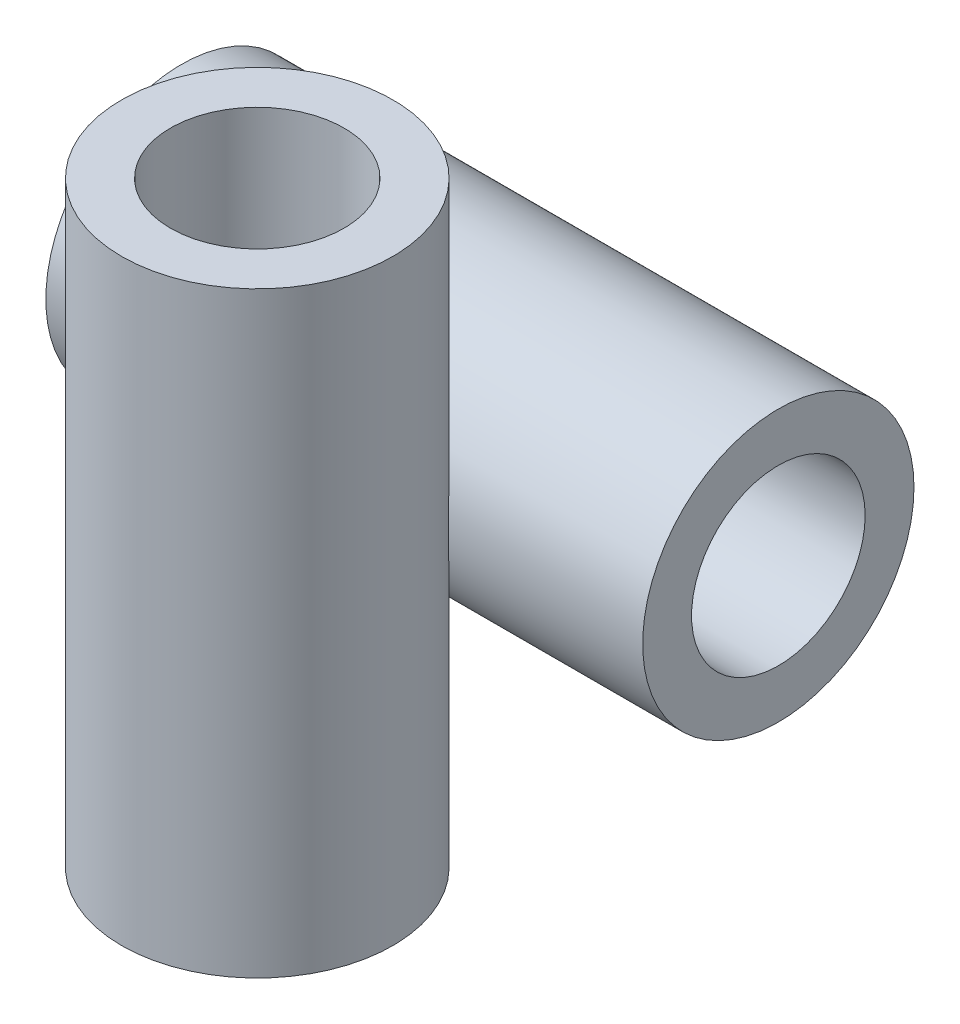
ISO-10303-21;
HEADER;
FILE_DESCRIPTION(('STEP AP214'),'2;1');
FILE_NAME('part.step','',(''),(''),'','','');
FILE_SCHEMA(('AUTOMOTIVE_DESIGN { 1 0 10303 214 1 1 1 1 }'));
ENDSEC;
DATA;
#1=APPLICATION_CONTEXT('core data for automotive mechanical design processes');
#2=APPLICATION_PROTOCOL_DEFINITION('international standard','automotive_design',2000,#1);
#3=PRODUCT_CONTEXT('',#1,'mechanical');
#4=PRODUCT('Part','Part','',(#3));
#5=PRODUCT_RELATED_PRODUCT_CATEGORY('part','',(#4));
#6=PRODUCT_DEFINITION_FORMATION('','',#4);
#7=PRODUCT_DEFINITION_CONTEXT('part definition',#1,'design');
#8=PRODUCT_DEFINITION('design','',#6,#7);
#9=PRODUCT_DEFINITION_SHAPE('','',#8);
#10=(LENGTH_UNIT() NAMED_UNIT(*) SI_UNIT(.MILLI.,.METRE.));
#11=(NAMED_UNIT(*) PLANE_ANGLE_UNIT() SI_UNIT($,.RADIAN.));
#12=(NAMED_UNIT(*) SI_UNIT($,.STERADIAN.) SOLID_ANGLE_UNIT());
#13=UNCERTAINTY_MEASURE_WITH_UNIT(LENGTH_MEASURE(1.E-05),#10,'distance_accuracy_value','');
#14=(GEOMETRIC_REPRESENTATION_CONTEXT(3) GLOBAL_UNCERTAINTY_ASSIGNED_CONTEXT((#13)) GLOBAL_UNIT_ASSIGNED_CONTEXT((#10,
#11,#12)) REPRESENTATION_CONTEXT('',''));
#15=CARTESIAN_POINT('',(0.,0.,0.));
#16=DIRECTION('',(0.,0.,1.));
#17=DIRECTION('',(1.,0.,0.));
#18=AXIS2_PLACEMENT_3D('',#15,#16,#17);
#19=CARTESIAN_POINT('',(0.,110.,0.));
#20=DIRECTION('',(0.,1.,0.));
#21=DIRECTION('',(0.,0.,1.));
#22=AXIS2_PLACEMENT_3D('',#19,#20,#21);
#23=PLANE('',#22);
#24=CARTESIAN_POINT('',(0.,110.,0.));
#25=DIRECTION('',(0.,1.,0.));
#26=DIRECTION('',(0.,0.,1.));
#27=AXIS2_PLACEMENT_3D('',#24,#25,#26);
#28=CIRCLE('',#27,25.);
#29=CARTESIAN_POINT('',(0.,110.,25.));
#30=VERTEX_POINT('',#29);
#31=EDGE_CURVE('E10',#30,#30,#28,.T.);
#32=ORIENTED_EDGE('',*,*,#31,.T.);
#33=EDGE_LOOP('',(#32));
#34=FACE_BOUND('',#33,.T.);
#35=CARTESIAN_POINT('',(0.,110.,0.));
#36=DIRECTION('',(0.,1.,0.));
#37=DIRECTION('',(0.,0.,1.));
#38=AXIS2_PLACEMENT_3D('',#35,#36,#37);
#39=CIRCLE('',#38,16.);
#40=CARTESIAN_POINT('',(0.,110.,16.));
#41=VERTEX_POINT('',#40);
#42=EDGE_CURVE('E55',#41,#41,#39,.T.);
#43=ORIENTED_EDGE('',*,*,#42,.F.);
#44=EDGE_LOOP('',(#43));
#45=FACE_BOUND('',#44,.T.);
#46=ADVANCED_FACE('F37',(#34,#45),#23,.T.);
#47=CARTESIAN_POINT('',(0.,0.,0.));
#48=DIRECTION('',(0.,1.,0.));
#49=DIRECTION('',(0.,0.,1.));
#50=AXIS2_PLACEMENT_3D('',#47,#48,#49);
#51=PLANE('',#50);
#52=CARTESIAN_POINT('',(0.,0.,0.));
#53=DIRECTION('',(0.,1.,0.));
#54=DIRECTION('',(0.,0.,1.));
#55=AXIS2_PLACEMENT_3D('',#52,#53,#54);
#56=CIRCLE('',#55,25.);
#57=CARTESIAN_POINT('',(0.,0.,25.));
#58=VERTEX_POINT('',#57);
#59=EDGE_CURVE('E50',#58,#58,#56,.T.);
#60=ORIENTED_EDGE('',*,*,#59,.F.);
#61=EDGE_LOOP('',(#60));
#62=FACE_BOUND('',#61,.T.);
#63=CARTESIAN_POINT('',(0.,0.,0.));
#64=DIRECTION('',(0.,1.,0.));
#65=DIRECTION('',(0.,0.,1.));
#66=AXIS2_PLACEMENT_3D('',#63,#64,#65);
#67=CIRCLE('',#66,16.);
#68=CARTESIAN_POINT('',(0.,0.,16.));
#69=VERTEX_POINT('',#68);
#70=EDGE_CURVE('E57',#69,#69,#67,.T.);
#71=ORIENTED_EDGE('',*,*,#70,.T.);
#72=EDGE_LOOP('',(#71));
#73=FACE_BOUND('',#72,.T.);
#74=ADVANCED_FACE('F100',(#62,#73),#51,.F.);
#75=CARTESIAN_POINT('',(0.,110.,0.));
#76=DIRECTION('',(0.,-1.,0.));
#77=DIRECTION('',(0.,0.,-1.));
#78=AXIS2_PLACEMENT_3D('',#75,#76,#77);
#79=CYLINDRICAL_SURFACE('',#78,25.);
#80=CARTESIAN_POINT('',(0.,74.3282862126411,-25.));
#81=CARTESIAN_POINT('',(-0.517953633721764,74.3282873528692,-24.9999975044833));
#82=CARTESIAN_POINT('',(-1.0359587833521,74.3148507108705,-24.9838813194227));
#83=CARTESIAN_POINT('',(-2.06875068696084,74.2608799539766,-24.9196333783539));
#84=CARTESIAN_POINT('',(-2.58353604379598,74.2203348018526,-24.8714885819377));
#85=CARTESIAN_POINT('',(-3.60717211940676,74.1114056479138,-24.7437825866778));
#86=CARTESIAN_POINT('',(-4.11601073608163,74.0429725518489,-24.6641659919821));
#87=CARTESIAN_POINT('',(-5.12323102727105,73.8772698830369,-24.4747840542282));
#88=CARTESIAN_POINT('',(-5.6216138234165,73.7800034204537,-24.3650219629631));
#89=CARTESIAN_POINT('',(-6.60514596088624,73.5551685844986,-24.1169988872739));
#90=CARTESIAN_POINT('',(-7.09027338347401,73.427553051749,-23.9786935942712));
#91=CARTESIAN_POINT('',(-8.04281266569251,73.1406509004897,-23.6762086365341));
#92=CARTESIAN_POINT('',(-8.51022408757037,72.9813634999917,-23.5120283329583));
#93=CARTESIAN_POINT('',(-9.42325503437416,72.6298393360986,-23.1612008972291));
#94=CARTESIAN_POINT('',(-9.86889267029019,72.4376305770212,-22.9745728998937));
#95=CARTESIAN_POINT('',(-10.7352322933322,72.0189712097561,-22.5827540024518));
#96=CARTESIAN_POINT('',(-11.1559354321027,71.7925221847349,-22.3775639607744));
#97=CARTESIAN_POINT('',(-11.9575907378433,71.3115492804688,-21.9593853583685));
#98=CARTESIAN_POINT('',(-12.3393324261994,71.0580051552465,-21.7467836707533));
#99=CARTESIAN_POINT('',(-13.0736108004531,70.5177425844619,-21.3134336599617));
#100=CARTESIAN_POINT('',(-13.4261480125292,70.2310247368155,-21.0926854836646));
#101=CARTESIAN_POINT('',(-14.0999462354905,69.6250201195386,-20.6483511042888));
#102=CARTESIAN_POINT('',(-14.4212119998021,69.3057383149597,-20.4247653383976));
#103=CARTESIAN_POINT('',(-15.0311894996748,68.6358609974691,-19.9801359230844));
#104=CARTESIAN_POINT('',(-15.3199021792396,68.285266393123,-19.7590922001129));
#105=CARTESIAN_POINT('',(-15.8503609773594,67.5732949420723,-19.3358563145572));
#106=CARTESIAN_POINT('',(-16.0937466419236,67.2133671982754,-19.1332766642712));
#107=CARTESIAN_POINT('',(-16.5507112062009,66.469269288606,-18.7393964895579));
#108=CARTESIAN_POINT('',(-16.7642911934181,66.0851000079649,-18.5480955537571));
#109=CARTESIAN_POINT('',(-17.1622217909257,65.2949604113229,-18.180527027844));
#110=CARTESIAN_POINT('',(-17.3465668633523,64.8889859843032,-18.004262288899));
#111=CARTESIAN_POINT('',(-17.6868667536758,64.0580373899516,-17.6700776351442));
#112=CARTESIAN_POINT('',(-17.8428205571564,63.6330625444129,-17.5121583758889));
#113=CARTESIAN_POINT('',(-18.1312124813944,62.7554185143635,-17.2134658601824));
#114=CARTESIAN_POINT('',(-18.2629122063517,62.3023129537141,-17.0732624582864));
#115=CARTESIAN_POINT('',(-18.4987564190375,61.3822199560502,-16.8174400998506));
#116=CARTESIAN_POINT('',(-18.6029005844273,60.9152323567178,-16.7018214309006));
#117=CARTESIAN_POINT('',(-18.7848230236158,59.9703380572837,-16.4969454651314));
#118=CARTESIAN_POINT('',(-18.8625941446095,59.4924284324017,-16.4076953207352));
#119=CARTESIAN_POINT('',(-18.992713513834,58.5288395794921,-16.2568983868913));
#120=CARTESIAN_POINT('',(-19.0450607720634,58.043160049666,-16.195352676257));
#121=CARTESIAN_POINT('',(-19.1276543603636,57.0351664864274,-16.0977401088489));
#122=CARTESIAN_POINT('',(-19.1562371881154,56.5125285186579,-16.0635960967964));
#123=CARTESIAN_POINT('',(-19.1858303252451,55.4653511081407,-16.0282386715825));
#124=CARTESIAN_POINT('',(-19.1868394689839,54.9408115859449,-16.0270266505753));
#125=CARTESIAN_POINT('',(-19.1612958819862,53.8932156868591,-16.0575571102573));
#126=CARTESIAN_POINT('',(-19.1347356171913,53.3701597545771,-16.0893085990837));
#127=CARTESIAN_POINT('',(-19.0536090384722,52.329219992043,-16.185299569881));
#128=CARTESIAN_POINT('',(-18.9990425740923,51.811336189592,-16.2495392263855));
#129=CARTESIAN_POINT('',(-18.8592143205492,50.7706375763244,-16.4116364039449));
#130=CARTESIAN_POINT('',(-18.7731733060007,50.2480591255066,-16.5103441615603));
#131=CARTESIAN_POINT('',(-18.5693801649537,49.2161106293367,-16.7392227570062));
#132=CARTESIAN_POINT('',(-18.4516272442795,48.7067409151272,-16.8693943827923));
#133=CARTESIAN_POINT('',(-18.1829067435898,47.7054482549207,-17.158695770974));
#134=CARTESIAN_POINT('',(-18.0319502428985,47.2135195526608,-17.3178158708285));
#135=CARTESIAN_POINT('',(-17.6951852481737,46.2510409314318,-17.6617751736294));
#136=CARTESIAN_POINT('',(-17.5093786686043,45.780489839862,-17.8466129636488));
#137=CARTESIAN_POINT('',(-17.109185952697,44.8821188787339,-18.2304587461717));
#138=CARTESIAN_POINT('',(-16.8961489260112,44.4533555576828,-18.4286648126151));
#139=CARTESIAN_POINT('',(-16.4355219393306,43.6226790728621,-18.8406217026762));
#140=CARTESIAN_POINT('',(-16.1879329060349,43.2207651894069,-19.0543721093148));
#141=CARTESIAN_POINT('',(-15.6579562166463,42.4469604522606,-19.4922145888716));
#142=CARTESIAN_POINT('',(-15.3755864451691,42.0750543297577,-19.7163013099746));
#143=CARTESIAN_POINT('',(-14.7762914546793,41.3634505091307,-20.1693384514433));
#144=CARTESIAN_POINT('',(-14.4593680007335,41.0237511674796,-20.3982886228943));
#145=CARTESIAN_POINT('',(-13.8135538485315,40.3989675704294,-20.8405591359707));
#146=CARTESIAN_POINT('',(-13.486737644505,40.1117771547534,-21.0539392748365));
#147=CARTESIAN_POINT('',(-12.8054225504333,39.567798393764,-21.4751368060656));
#148=CARTESIAN_POINT('',(-12.4509249256213,39.3110086602765,-21.6829544520912));
#149=CARTESIAN_POINT('',(-11.7162788758663,38.8279289324475,-22.0885689440324));
#150=CARTESIAN_POINT('',(-11.3361270763312,38.6016429624023,-22.2863644656064));
#151=CARTESIAN_POINT('',(-10.5527014718426,38.1792063282116,-22.6678253812894));
#152=CARTESIAN_POINT('',(-10.1494271467532,37.983056342334,-22.8514904573194));
#153=CARTESIAN_POINT('',(-9.3231544855695,37.6203622250153,-23.2008554655049));
#154=CARTESIAN_POINT('',(-8.90018640094788,37.4537744615558,-23.3665817308227));
#155=CARTESIAN_POINT('',(-8.03688618449848,37.1487858540668,-23.6773931462552));
#156=CARTESIAN_POINT('',(-7.59655417090433,37.010384818149,-23.8224784368864));
#157=CARTESIAN_POINT('',(-6.70137677749992,36.7605671684782,-24.0896199372428));
#158=CARTESIAN_POINT('',(-6.24652789462596,36.6491571244952,-24.2116705385914));
#159=CARTESIAN_POINT('',(-5.32535994069889,36.4522186245966,-24.4308151290843));
#160=CARTESIAN_POINT('',(-4.85904037493124,36.3666912870896,-24.5279080397632));
#161=CARTESIAN_POINT('',(-3.88848947428199,36.2159593621827,-24.7009615928077));
#162=CARTESIAN_POINT('',(-3.38370675714088,36.1523537577379,-24.7752278631062));
#163=CARTESIAN_POINT('',(-2.36788706688761,36.0522965352221,-24.8928621795608));
#164=CARTESIAN_POINT('',(-1.85684986083351,36.0158459316583,-24.9362290713177));
#165=CARTESIAN_POINT('',(-0.831715086756126,35.96953151271,-24.9914347890302));
#166=CARTESIAN_POINT('',(-0.317616607316615,35.9596760574163,-25.0032637011194));
#167=CARTESIAN_POINT('',(0.710162093404742,35.9664200588575,-24.995195355557));
#168=CARTESIAN_POINT('',(1.22384230617212,35.9830200412983,-24.9752974674504));
#169=CARTESIAN_POINT('',(2.27057188325956,36.0442901989976,-24.9024490846939));
#170=CARTESIAN_POINT('',(2.80344940320723,36.0901931294379,-24.8480477383005));
#171=CARTESIAN_POINT('',(3.86128244842455,36.2119469635966,-24.7057750137966));
#172=CARTESIAN_POINT('',(4.38623768814633,36.2877989441241,-24.617902432242));
#173=CARTESIAN_POINT('',(5.42425320223713,36.4706207252682,-24.4101942929505));
#174=CARTESIAN_POINT('',(5.93731430510363,36.5775883514205,-24.2903609687848));
#175=CARTESIAN_POINT('',(6.94755218266854,36.8241149622915,-24.020923588708));
#176=CARTESIAN_POINT('',(7.4447294944952,36.9636728436051,-23.871320540733));
#177=CARTESIAN_POINT('',(8.41097718014846,37.2743626145838,-23.5480493417089));
#178=CARTESIAN_POINT('',(8.88037893977275,37.4449262192408,-23.3748264672394));
#179=CARTESIAN_POINT('',(9.79607606582866,37.8205781002481,-23.0060966415598));
#180=CARTESIAN_POINT('',(10.2423716475406,38.0256660548593,-22.8105898980229));
#181=CARTESIAN_POINT('',(11.1079181464921,38.4713862135064,-22.4018544705741));
#182=CARTESIAN_POINT('',(11.5271856418407,38.711996325632,-22.1886368371937));
#183=CARTESIAN_POINT('',(12.335644448553,39.2294735944165,-21.7495622621362));
#184=CARTESIAN_POINT('',(12.7248377996581,39.5063382887155,-21.5237061794409));
#185=CARTESIAN_POINT('',(13.4462263418309,40.0770785274814,-21.0800048390239));
#186=CARTESIAN_POINT('',(13.7804808466549,40.3686886264402,-20.8625890903034));
#187=CARTESIAN_POINT('',(14.4186191079555,40.9827481817933,-20.426765006898));
#188=CARTESIAN_POINT('',(14.7225042522597,41.3051962276273,-20.2083567180478));
#189=CARTESIAN_POINT('',(15.2988728053646,41.9794966025844,-19.7756015597316));
#190=CARTESIAN_POINT('',(15.5713574683479,42.331347756334,-19.5612545283388));
#191=CARTESIAN_POINT('',(16.0845849378449,43.0624408407974,-19.1414754840572));
#192=CARTESIAN_POINT('',(16.3253276991401,43.44168281053,-18.9360434838688));
#193=CARTESIAN_POINT('',(16.7686407365233,44.2134064878821,-18.5444758504696));
#194=CARTESIAN_POINT('',(16.9721312780594,44.6051620971073,-18.3579486519958));
#195=CARTESIAN_POINT('',(17.3501262871487,45.4094670545126,-18.001130484302));
#196=CARTESIAN_POINT('',(17.5246314741303,45.8220158862649,-17.8308391121469));
#197=CARTESIAN_POINT('',(17.8456614358648,46.6652202719794,-17.5095397692082));
#198=CARTESIAN_POINT('',(17.992179689506,47.0958800174328,-17.3585362953216));
#199=CARTESIAN_POINT('',(18.2583079124454,47.9723561538072,-17.0783937163301));
#200=CARTESIAN_POINT('',(18.3779167318708,48.4181731914811,-16.9492555456147));
#201=CARTESIAN_POINT('',(18.5965953539385,49.3442728617745,-16.7091092425585));
#202=CARTESIAN_POINT('',(18.6943690649822,49.8251731848173,-16.5993019276714));
#203=CARTESIAN_POINT('',(18.8627345110882,50.7972007156519,-16.4077271870539));
#204=CARTESIAN_POINT('',(18.933325515515,51.2883281979623,-16.3259605150259));
#205=CARTESIAN_POINT('',(19.0482990336191,52.2777444443053,-16.1916684982395));
#206=CARTESIAN_POINT('',(19.0926736706394,52.7760353145497,-16.1391519418931));
#207=CARTESIAN_POINT('',(19.1558264682133,53.7764865240159,-16.0641434970459));
#208=CARTESIAN_POINT('',(19.1746038337553,54.2786469829341,-16.0416525410943));
#209=CARTESIAN_POINT('',(19.1872041788129,55.3132747149543,-16.0265823858399));
#210=CARTESIAN_POINT('',(19.1794959317984,55.8457889104823,-16.0358385448125));
#211=CARTESIAN_POINT('',(19.1355719620163,56.907986478408,-16.0882267690925));
#212=CARTESIAN_POINT('',(19.0993550500107,57.4376697317851,-16.1313602475911));
#213=CARTESIAN_POINT('',(18.9978032984884,58.4905506035063,-16.2508343316717));
#214=CARTESIAN_POINT('',(18.9324642415243,59.0137472711843,-16.3271797469432));
#215=CARTESIAN_POINT('',(18.7716456153338,60.0497757535449,-16.5118229770124));
#216=CARTESIAN_POINT('',(18.6761664279343,60.5626076994445,-16.6201203870286));
#217=CARTESIAN_POINT('',(18.4531067695903,61.5768033465673,-16.8674455516515));
#218=CARTESIAN_POINT('',(18.3253538207701,62.078089114665,-17.0066379141821));
#219=CARTESIAN_POINT('',(18.0364394317021,63.0622653225011,-17.3127442404446));
#220=CARTESIAN_POINT('',(17.8752776789587,63.5451555901237,-17.4796584634754));
#221=CARTESIAN_POINT('',(17.5180723573554,64.488269060634,-17.8376287096808));
#222=CARTESIAN_POINT('',(17.3220473330991,64.9485041489882,-18.0286718825101));
#223=CARTESIAN_POINT('',(16.8937283460529,65.8426698746865,-18.4306300134555));
#224=CARTESIAN_POINT('',(16.6614368775599,66.2766023182001,-18.6415436045487));
#225=CARTESIAN_POINT('',(16.173538665676,67.091546267832,-19.0660779356107));
#226=CARTESIAN_POINT('',(15.9199152685591,67.4741556014302,-19.2789126569829));
#227=CARTESIAN_POINT('',(15.3793917918431,68.2100937146553,-19.7127964306165));
#228=CARTESIAN_POINT('',(15.0924930112956,68.5634236364109,-19.9338451619791));
#229=CARTESIAN_POINT('',(14.4860867282448,69.2386454489926,-20.3787784272938));
#230=CARTESIAN_POINT('',(14.1665915355199,69.5605491184845,-20.6026618629707));
#231=CARTESIAN_POINT('',(13.4961931463102,70.1717225129374,-21.047912486967));
#232=CARTESIAN_POINT('',(13.1452907907968,70.4609931112266,-21.269279742482));
#233=CARTESIAN_POINT('',(12.4331562657018,70.9920641063499,-21.6928377161064));
#234=CARTESIAN_POINT('',(12.0734174114919,71.2355534755847,-21.895426430788));
#235=CARTESIAN_POINT('',(11.3296924190018,71.6927355392826,-22.2893497966137));
#236=CARTESIAN_POINT('',(10.9457070663019,71.9064291984003,-22.4806848119874));
#237=CARTESIAN_POINT('',(10.1557470133778,72.3046853215707,-22.8484298474253));
#238=CARTESIAN_POINT('',(9.74975817878667,72.4892287552372,-23.0248300829148));
#239=CARTESIAN_POINT('',(8.91876591619526,72.8299000189021,-23.3592858202235));
#240=CARTESIAN_POINT('',(8.49376226225129,72.9860275111361,-23.5173411039785));
#241=CARTESIAN_POINT('',(7.61580418029329,73.2748284269027,-23.8163891924363));
#242=CARTESIAN_POINT('',(7.16240383209262,73.4067477686921,-23.9568004627071));
#243=CARTESIAN_POINT('',(6.24163957454573,73.6429951991611,-24.2130201759535));
#244=CARTESIAN_POINT('',(5.77427410715302,73.747320196334,-24.3288258619798));
#245=CARTESIAN_POINT('',(4.82939443484276,73.9294009054188,-24.5338614754249));
#246=CARTESIAN_POINT('',(4.35189537388473,74.0071936550095,-24.6231284270392));
#247=CARTESIAN_POINT('',(3.38929188999828,74.1373706078771,-24.7739769516298));
#248=CARTESIAN_POINT('',(2.90419020891768,74.1897637631892,-24.8355682782635));
#249=CARTESIAN_POINT('',(2.01607743003004,74.2627511854035,-24.9218285805716));
#250=CARTESIAN_POINT('',(1.61383184410894,74.2873467423379,-24.9511195442129));
#251=CARTESIAN_POINT('',(0.807734609049487,74.3201137788239,-24.9902061882189));
#252=CARTESIAN_POINT('',(0.403882966288693,74.3282853235293,-25.0000019459207));
#253=CARTESIAN_POINT('',(0.,74.3282862126411,-25.));
#254=B_SPLINE_CURVE_WITH_KNOTS('',3,(#80,#81,#82,#83,#84,#85,#86,#87,#88,#89,#90,#91,#92,#93,
#94,#95,#96,#97,#98,#99,#100,#101,#102,#103,#104,#105,#106,#107,#108,#109,#110,#111,#112,#113,
#114,#115,#116,#117,#118,#119,#120,#121,#122,#123,#124,#125,#126,#127,#128,#129,#130,#131,#132,
#133,#134,#135,#136,#137,#138,#139,#140,#141,#142,#143,#144,#145,#146,#147,#148,#149,#150,#151,
#152,#153,#154,#155,#156,#157,#158,#159,#160,#161,#162,#163,#164,#165,#166,#167,#168,#169,#170,
#171,#172,#173,#174,#175,#176,#177,#178,#179,#180,#181,#182,#183,#184,#185,#186,#187,#188,#189,
#190,#191,#192,#193,#194,#195,#196,#197,#198,#199,#200,#201,#202,#203,#204,#205,#206,#207,#208,
#209,#210,#211,#212,#213,#214,#215,#216,#217,#218,#219,#220,#221,#222,#223,#224,#225,#226,#227,
#228,#229,#230,#231,#232,#233,#234,#235,#236,#237,#238,#239,#240,#241,#242,#243,#244,#245,#246,
#247,#248,#249,#250,#251,#252,#253),.UNSPECIFIED.,.T.,.F.,(4,2,2,2,2,2,2,2,2,2,2,2,2,2,2,2,2,2,
2,2,2,2,2,2,2,2,2,2,2,2,2,2,2,2,2,2,2,2,2,2,2,2,2,2,2,2,2,2,2,2,2,2,2,2,2,2,2,2,2,2,2,2,2,2,2,2,
2,2,2,2,2,2,2,2,2,2,2,2,2,2,2,2,2,2,2,2,4),(0.,1.55352465201085,3.10768220702343,
4.66458761926447,6.22132515411726,7.78049769178245,9.33970873068249,10.8975999658404,
12.455419190834,13.9690045911451,15.4825627151756,16.9958904098552,18.5091742083973,
19.9456939188679,21.3821612020851,22.8189002659015,24.2556906541406,25.7308139769738,
27.2059545547054,28.6814948955253,30.1570926890589,31.728899025878,33.3007718085245,
34.8730742594333,36.4453851571894,38.05959527214,39.673845816254,41.2875585344432,
42.9011826304286,44.4536863066944,46.0061483521737,47.5578154123195,49.1094032475069,
50.5613805355629,52.0132914969792,53.4653938188323,54.9175288182302,56.367502399725,
57.8174661098337,59.267782396057,60.7181613424494,62.2589419293826,63.7997800767806,
65.3411025248046,66.8824556013967,68.4933558377208,70.1043139987492,71.7151596077195,
73.3259506863524,74.9097492097159,76.49353297417,78.0763358704271,79.6590313206575,
81.1391508564288,82.619202722317,84.0991954521965,85.5791902904038,87.0152974819608,
88.451369023418,89.8877747704791,91.3242418852568,92.8312071294024,94.3382128759782,
95.8456711695644,97.3531762814076,98.9492664725514,100.54542324807,102.141811252963,
103.738179034995,105.343265619555,106.948367218283,108.552617565016,110.156757624809,
111.672724992192,113.188633197002,114.703971035247,116.219268310305,117.655533351943,
119.091751882813,120.528904191303,121.966073581302,123.442361944009,124.918815631322,
126.393199746212,127.867063838944,129.078455347509,130.289842050501),.UNSPECIFIED.);
#255=CARTESIAN_POINT('',(0.,74.3282862126411,-25.));
#256=VERTEX_POINT('',#255);
#257=EDGE_CURVE('E42',#256,#256,#254,.T.);
#258=ORIENTED_EDGE('',*,*,#257,.T.);
#259=EDGE_LOOP('',(#258));
#260=FACE_BOUND('',#259,.T.);
#261=ORIENTED_EDGE('',*,*,#31,.F.);
#262=EDGE_LOOP('',(#261));
#263=FACE_BOUND('',#262,.T.);
#264=ORIENTED_EDGE('',*,*,#59,.T.);
#265=EDGE_LOOP('',(#264));
#266=FACE_BOUND('',#265,.T.);
#267=ADVANCED_FACE('F39',(#260,#263,#266),#79,.T.);
#268=CARTESIAN_POINT('',(0.,110.,0.));
#269=DIRECTION('',(0.,-1.,0.));
#270=DIRECTION('',(0.,0.,-1.));
#271=AXIS2_PLACEMENT_3D('',#268,#269,#270);
#272=CYLINDRICAL_SURFACE('',#271,16.);
#273=ORIENTED_EDGE('',*,*,#42,.T.);
#274=EDGE_LOOP('',(#273));
#275=FACE_BOUND('',#274,.T.);
#276=ORIENTED_EDGE('',*,*,#70,.F.);
#277=EDGE_LOOP('',(#276));
#278=FACE_BOUND('',#277,.T.);
#279=ADVANCED_FACE('F93',(#275,#278),#272,.F.);
#280=CARTESIAN_POINT('',(-55.,55.1453451706936,-41.0316802918835));
#281=DIRECTION('',(1.,0.,0.));
#282=DIRECTION('',(0.,0.,-1.));
#283=AXIS2_PLACEMENT_3D('',#280,#281,#282);
#284=CYLINDRICAL_SURFACE('',#283,25.);
#285=CARTESIAN_POINT('',(-55.,55.1453451706936,-41.0316802918835));
#286=DIRECTION('',(1.,0.,0.));
#287=DIRECTION('',(0.,0.,-1.));
#288=AXIS2_PLACEMENT_3D('',#285,#286,#287);
#289=CIRCLE('',#288,25.);
#290=CARTESIAN_POINT('',(-55.,55.1453451706936,-66.0316802918835));
#291=VERTEX_POINT('',#290);
#292=EDGE_CURVE('E62',#291,#291,#289,.T.);
#293=ORIENTED_EDGE('',*,*,#292,.T.);
#294=EDGE_LOOP('',(#293));
#295=FACE_BOUND('',#294,.T.);
#296=CARTESIAN_POINT('',(55.,55.1453451706936,-41.0316802918835));
#297=DIRECTION('',(1.,0.,0.));
#298=DIRECTION('',(0.,0.,-1.));
#299=AXIS2_PLACEMENT_3D('',#296,#297,#298);
#300=CIRCLE('',#299,25.);
#301=CARTESIAN_POINT('',(55.,55.1453451706936,-66.0316802918835));
#302=VERTEX_POINT('',#301);
#303=EDGE_CURVE('E65',#302,#302,#300,.T.);
#304=ORIENTED_EDGE('',*,*,#303,.F.);
#305=EDGE_LOOP('',(#304));
#306=FACE_BOUND('',#305,.T.);
#307=ORIENTED_EDGE('',*,*,#257,.F.);
#308=EDGE_LOOP('',(#307));
#309=FACE_BOUND('',#308,.T.);
#310=ADVANCED_FACE('F90',(#295,#306,#309),#284,.T.);
#311=CARTESIAN_POINT('',(-55.,55.1453451706936,-41.0316802918835));
#312=DIRECTION('',(1.,0.,0.));
#313=DIRECTION('',(0.,0.,-1.));
#314=AXIS2_PLACEMENT_3D('',#311,#312,#313);
#315=PLANE('',#314);
#316=CARTESIAN_POINT('',(-55.,55.1453451706936,-41.0316802918835));
#317=DIRECTION('',(1.,0.,0.));
#318=DIRECTION('',(0.,0.,-1.));
#319=AXIS2_PLACEMENT_3D('',#316,#317,#318);
#320=CIRCLE('',#319,16.);
#321=CARTESIAN_POINT('',(-55.,55.1453451706936,-57.0316802918835));
#322=VERTEX_POINT('',#321);
#323=EDGE_CURVE('E68',#322,#322,#320,.T.);
#324=ORIENTED_EDGE('',*,*,#323,.T.);
#325=EDGE_LOOP('',(#324));
#326=FACE_BOUND('',#325,.T.);
#327=ORIENTED_EDGE('',*,*,#292,.F.);
#328=EDGE_LOOP('',(#327));
#329=FACE_BOUND('',#328,.T.);
#330=ADVANCED_FACE('F75',(#326,#329),#315,.F.);
#331=CARTESIAN_POINT('',(55.,55.1453451706936,-41.0316802918835));
#332=DIRECTION('',(1.,0.,0.));
#333=DIRECTION('',(0.,0.,-1.));
#334=AXIS2_PLACEMENT_3D('',#331,#332,#333);
#335=PLANE('',#334);
#336=CARTESIAN_POINT('',(55.,55.1453451706936,-41.0316802918835));
#337=DIRECTION('',(1.,0.,0.));
#338=DIRECTION('',(0.,0.,-1.));
#339=AXIS2_PLACEMENT_3D('',#336,#337,#338);
#340=CIRCLE('',#339,16.);
#341=CARTESIAN_POINT('',(55.,55.1453451706936,-57.0316802918835));
#342=VERTEX_POINT('',#341);
#343=EDGE_CURVE('E69',#342,#342,#340,.T.);
#344=ORIENTED_EDGE('',*,*,#343,.F.);
#345=EDGE_LOOP('',(#344));
#346=FACE_BOUND('',#345,.T.);
#347=ORIENTED_EDGE('',*,*,#303,.T.);
#348=EDGE_LOOP('',(#347));
#349=FACE_BOUND('',#348,.T.);
#350=ADVANCED_FACE('F81',(#346,#349),#335,.T.);
#351=CARTESIAN_POINT('',(-55.,55.1453451706936,-41.0316802918835));
#352=DIRECTION('',(1.,0.,0.));
#353=DIRECTION('',(0.,0.,-1.));
#354=AXIS2_PLACEMENT_3D('',#351,#352,#353);
#355=CYLINDRICAL_SURFACE('',#354,16.);
#356=ORIENTED_EDGE('',*,*,#323,.F.);
#357=EDGE_LOOP('',(#356));
#358=FACE_BOUND('',#357,.T.);
#359=ORIENTED_EDGE('',*,*,#343,.T.);
#360=EDGE_LOOP('',(#359));
#361=FACE_BOUND('',#360,.T.);
#362=ADVANCED_FACE('F78',(#358,#361),#355,.F.);
#363=CLOSED_SHELL('',(#46,#74,#267,#279,#310,#330,#350,#362));
#364=MANIFOLD_SOLID_BREP('B2',#363);
#365=ADVANCED_BREP_SHAPE_REPRESENTATION('',(#18,#364),#14);
#366=SHAPE_DEFINITION_REPRESENTATION(#9,#365);
ENDSEC;
END-ISO-10303-21;
